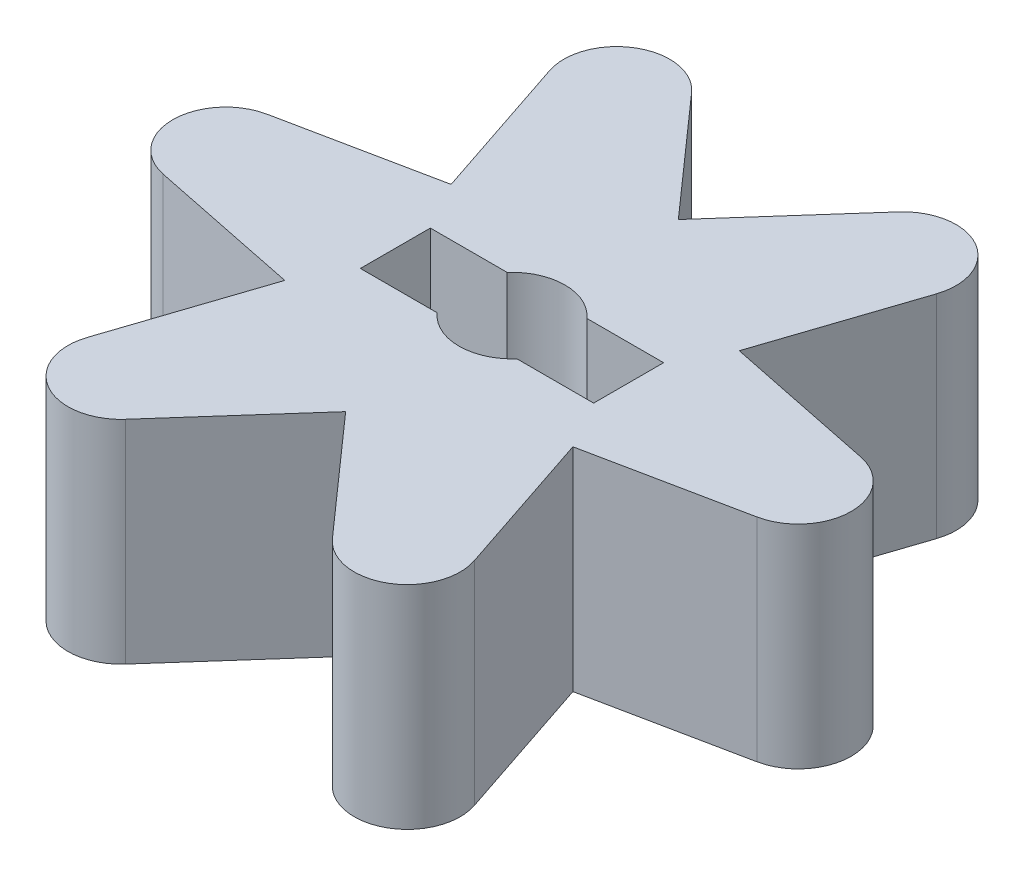
ISO-10303-21;
HEADER;
FILE_DESCRIPTION(('STEP AP214'),'2;1');
FILE_NAME('part.step','',(''),(''),'','','');
FILE_SCHEMA(('AUTOMOTIVE_DESIGN { 1 0 10303 214 1 1 1 1 }'));
ENDSEC;
DATA;
#1=APPLICATION_CONTEXT('core data for automotive mechanical design processes');
#2=APPLICATION_PROTOCOL_DEFINITION('international standard','automotive_design',2000,#1);
#3=PRODUCT_CONTEXT('',#1,'mechanical');
#4=PRODUCT('Part','Part','',(#3));
#5=PRODUCT_RELATED_PRODUCT_CATEGORY('part','',(#4));
#6=PRODUCT_DEFINITION_FORMATION('','',#4);
#7=PRODUCT_DEFINITION_CONTEXT('part definition',#1,'design');
#8=PRODUCT_DEFINITION('design','',#6,#7);
#9=PRODUCT_DEFINITION_SHAPE('','',#8);
#10=(LENGTH_UNIT() NAMED_UNIT(*) SI_UNIT(.MILLI.,.METRE.));
#11=(NAMED_UNIT(*) PLANE_ANGLE_UNIT() SI_UNIT($,.RADIAN.));
#12=(NAMED_UNIT(*) SI_UNIT($,.STERADIAN.) SOLID_ANGLE_UNIT());
#13=UNCERTAINTY_MEASURE_WITH_UNIT(LENGTH_MEASURE(1.E-05),#10,'distance_accuracy_value','');
#14=(GEOMETRIC_REPRESENTATION_CONTEXT(3) GLOBAL_UNCERTAINTY_ASSIGNED_CONTEXT((#13)) GLOBAL_UNIT_ASSIGNED_CONTEXT((#10,
#11,#12)) REPRESENTATION_CONTEXT('',''));
#15=CARTESIAN_POINT('',(0.,0.,0.));
#16=DIRECTION('',(0.,0.,1.));
#17=DIRECTION('',(1.,0.,0.));
#18=AXIS2_PLACEMENT_3D('',#15,#16,#17);
#19=CARTESIAN_POINT('',(0.,10.,0.));
#20=DIRECTION('',(0.,1.,0.));
#21=DIRECTION('',(0.,0.,1.));
#22=AXIS2_PLACEMENT_3D('',#19,#20,#21);
#23=PLANE('',#22);
#24=DIRECTION('',(0.979741032851596,0.,0.200268591014389));
#25=VECTOR('',#24,1.);
#26=CARTESIAN_POINT('',(1.04212284291897,10.,-5.0982058909393));
#27=LINE('',#26,#25);
#28=CARTESIAN_POINT('',(6.79393419734496,10.,-3.92247973769372));
#29=VERTEX_POINT('',#28);
#30=CARTESIAN_POINT('',(14.000671477536,10.,-2.44935258212899));
#31=VERTEX_POINT('',#30);
#32=EDGE_CURVE('E352',#29,#31,#27,.T.);
#33=ORIENTED_EDGE('',*,*,#32,.F.);
#34=DIRECTION('',(0.316432829027221,0.,-0.948614919086681));
#35=VECTOR('',#34,1.);
#36=CARTESIAN_POINT('',(4.93623723673639,10.,1.64659808963776));
#37=LINE('',#36,#35);
#38=CARTESIAN_POINT('',(9.12153729771669,10.,-10.9002608785219));
#39=VERTEX_POINT('',#38);
#40=EDGE_CURVE('E402',#29,#39,#37,.T.);
#41=ORIENTED_EDGE('',*,*,#40,.T.);
#42=CARTESIAN_POINT('',(6.75,10.,-11.6913429510899));
#43=DIRECTION('',(0.,1.,0.));
#44=DIRECTION('',(0.,0.,1.));
#45=AXIS2_PLACEMENT_3D('',#42,#43,#44);
#46=CIRCLE('',#45,2.5);
#47=CARTESIAN_POINT('',(4.87913417981926,10.,-13.3496134606509));
#48=VERTEX_POINT('',#47);
#49=EDGE_CURVE('E494',#48,#39,#46,.F.);
#50=ORIENTED_EDGE('',*,*,#49,.F.);
#51=DIRECTION('',(0.663308203824374,0.,-0.748346328072293));
#52=VECTOR('',#51,1.);
#53=CARTESIAN_POINT('',(-3.89411439381743,10.,-3.45160780130153));
#54=LINE('',#53,#52);
#55=CARTESIAN_POINT('',(0.,10.,-7.84495947538744));
#56=VERTEX_POINT('',#55);
#57=EDGE_CURVE('E491',#56,#48,#54,.T.);
#58=ORIENTED_EDGE('',*,*,#57,.F.);
#59=DIRECTION('',(-0.663308203824374,0.,-0.748346328072292));
#60=VECTOR('',#59,1.);
#61=CARTESIAN_POINT('',(3.89411439381742,10.,-3.45160780130153));
#62=LINE('',#61,#60);
#63=CARTESIAN_POINT('',(-4.87913417981927,10.,-13.3496134606509));
#64=VERTEX_POINT('',#63);
#65=EDGE_CURVE('E493',#56,#64,#62,.T.);
#66=ORIENTED_EDGE('',*,*,#65,.T.);
#67=CARTESIAN_POINT('',(-6.75000000000001,10.,-11.6913429510899));
#68=DIRECTION('',(0.,1.,0.));
#69=DIRECTION('',(0.,0.,1.));
#70=AXIS2_PLACEMENT_3D('',#67,#68,#69);
#71=CIRCLE('',#70,2.5);
#72=CARTESIAN_POINT('',(-9.12153729771671,10.,-10.9002608785219));
#73=VERTEX_POINT('',#72);
#74=EDGE_CURVE('E498',#73,#64,#71,.F.);
#75=ORIENTED_EDGE('',*,*,#74,.F.);
#76=DIRECTION('',(-0.316432829027222,0.,-0.94861491908668));
#77=VECTOR('',#76,1.);
#78=CARTESIAN_POINT('',(-4.93623723673639,10.,1.64659808963777));
#79=LINE('',#78,#77);
#80=CARTESIAN_POINT('',(-6.79393419734497,10.,-3.92247973769372));
#81=VERTEX_POINT('',#80);
#82=EDGE_CURVE('E506',#81,#73,#79,.T.);
#83=ORIENTED_EDGE('',*,*,#82,.F.);
#84=DIRECTION('',(-0.979741032851596,0.,0.200268591014388));
#85=VECTOR('',#84,1.);
#86=CARTESIAN_POINT('',(-1.04212284291896,10.,-5.09820589093929));
#87=LINE('',#86,#85);
#88=CARTESIAN_POINT('',(-14.000671477536,10.,-2.44935258212899));
#89=VERTEX_POINT('',#88);
#90=EDGE_CURVE('E510',#81,#89,#87,.T.);
#91=ORIENTED_EDGE('',*,*,#90,.T.);
#92=CARTESIAN_POINT('',(-13.5,10.,0.));
#93=DIRECTION('',(0.,1.,0.));
#94=DIRECTION('',(0.,0.,1.));
#95=AXIS2_PLACEMENT_3D('',#92,#93,#94);
#96=CIRCLE('',#95,2.5);
#97=CARTESIAN_POINT('',(-14.000671477536,10.,2.44935258212899));
#98=VERTEX_POINT('',#97);
#99=EDGE_CURVE('E513',#98,#89,#96,.F.);
#100=ORIENTED_EDGE('',*,*,#99,.F.);
#101=DIRECTION('',(-0.979741032851596,0.,-0.200268591014388));
#102=VECTOR('',#101,1.);
#103=CARTESIAN_POINT('',(-1.04212284291896,10.,5.0982058909393));
#104=LINE('',#103,#102);
#105=CARTESIAN_POINT('',(-6.79393419734496,10.,3.92247973769372));
#106=VERTEX_POINT('',#105);
#107=EDGE_CURVE('E517',#106,#98,#104,.T.);
#108=ORIENTED_EDGE('',*,*,#107,.F.);
#109=DIRECTION('',(-0.316432829027221,0.,0.948614919086681));
#110=VECTOR('',#109,1.);
#111=CARTESIAN_POINT('',(-4.93623723673639,10.,-1.64659808963776));
#112=LINE('',#111,#110);
#113=CARTESIAN_POINT('',(-9.1215372977167,10.,10.9002608785219));
#114=VERTEX_POINT('',#113);
#115=EDGE_CURVE('E521',#106,#114,#112,.T.);
#116=ORIENTED_EDGE('',*,*,#115,.T.);
#117=CARTESIAN_POINT('',(-6.75,10.,11.6913429510899));
#118=DIRECTION('',(0.,1.,0.));
#119=DIRECTION('',(0.,0.,1.));
#120=AXIS2_PLACEMENT_3D('',#117,#118,#119);
#121=CIRCLE('',#120,2.5);
#122=CARTESIAN_POINT('',(-4.87913417981927,10.,13.3496134606509));
#123=VERTEX_POINT('',#122);
#124=EDGE_CURVE('E524',#123,#114,#121,.F.);
#125=ORIENTED_EDGE('',*,*,#124,.F.);
#126=DIRECTION('',(-0.663308203824374,0.,0.748346328072292));
#127=VECTOR('',#126,1.);
#128=CARTESIAN_POINT('',(3.89411439381743,10.,3.45160780130153));
#129=LINE('',#128,#127);
#130=CARTESIAN_POINT('',(0.,10.,7.84495947538744));
#131=VERTEX_POINT('',#130);
#132=EDGE_CURVE('E528',#131,#123,#129,.T.);
#133=ORIENTED_EDGE('',*,*,#132,.F.);
#134=DIRECTION('',(0.663308203824374,0.,0.748346328072292));
#135=VECTOR('',#134,1.);
#136=CARTESIAN_POINT('',(-3.89411439381743,10.,3.45160780130153));
#137=LINE('',#136,#135);
#138=CARTESIAN_POINT('',(4.87913417981927,10.,13.3496134606509));
#139=VERTEX_POINT('',#138);
#140=EDGE_CURVE('E277',#131,#139,#137,.T.);
#141=ORIENTED_EDGE('',*,*,#140,.T.);
#142=CARTESIAN_POINT('',(6.75,10.,11.6913429510899));
#143=DIRECTION('',(0.,1.,0.));
#144=DIRECTION('',(0.,0.,1.));
#145=AXIS2_PLACEMENT_3D('',#142,#143,#144);
#146=CIRCLE('',#145,2.5);
#147=CARTESIAN_POINT('',(9.1215372977167,10.,10.9002608785219));
#148=VERTEX_POINT('',#147);
#149=EDGE_CURVE('E273',#148,#139,#146,.F.);
#150=ORIENTED_EDGE('',*,*,#149,.F.);
#151=DIRECTION('',(0.316432829027222,0.,0.94861491908668));
#152=VECTOR('',#151,1.);
#153=CARTESIAN_POINT('',(4.93623723673639,10.,-1.64659808963777));
#154=LINE('',#153,#152);
#155=CARTESIAN_POINT('',(6.79393419734496,10.,3.92247973769372));
#156=VERTEX_POINT('',#155);
#157=EDGE_CURVE('E251',#156,#148,#154,.T.);
#158=ORIENTED_EDGE('',*,*,#157,.F.);
#159=DIRECTION('',(0.979741032851596,0.,-0.200268591014389));
#160=VECTOR('',#159,1.);
#161=CARTESIAN_POINT('',(1.04212284291897,10.,5.0982058909393));
#162=LINE('',#161,#160);
#163=CARTESIAN_POINT('',(14.000671477536,10.,2.44935258212899));
#164=VERTEX_POINT('',#163);
#165=EDGE_CURVE('E262',#156,#164,#162,.T.);
#166=ORIENTED_EDGE('',*,*,#165,.T.);
#167=CARTESIAN_POINT('',(13.5,10.,0.));
#168=DIRECTION('',(0.,1.,0.));
#169=DIRECTION('',(0.,0.,1.));
#170=AXIS2_PLACEMENT_3D('',#167,#168,#169);
#171=CIRCLE('',#170,2.5);
#172=EDGE_CURVE('E267',#31,#164,#171,.F.);
#173=ORIENTED_EDGE('',*,*,#172,.F.);
#174=EDGE_LOOP('',(#33,#41,#50,#58,#66,#75,#83,#91,#100,#108,#116,#125,#133,#141,#150,#158,#166,#173));
#175=FACE_BOUND('',#174,.T.);
#176=CARTESIAN_POINT('',(0.,10.,0.));
#177=DIRECTION('',(0.,1.,0.));
#178=DIRECTION('',(0.,0.,1.));
#179=AXIS2_PLACEMENT_3D('',#176,#177,#178);
#180=CIRCLE('',#179,2.5);
#181=CARTESIAN_POINT('',(-1.87816399709929,10.,1.65));
#182=VERTEX_POINT('',#181);
#183=CARTESIAN_POINT('',(1.87816399709929,10.,1.65));
#184=VERTEX_POINT('',#183);
#185=EDGE_CURVE('E597',#182,#184,#180,.T.);
#186=ORIENTED_EDGE('',*,*,#185,.F.);
#187=DIRECTION('',(-1.,0.,0.));
#188=VECTOR('',#187,1.);
#189=CARTESIAN_POINT('',(0.,10.,1.65));
#190=LINE('',#189,#188);
#191=CARTESIAN_POINT('',(-5.5,10.,1.65));
#192=VERTEX_POINT('',#191);
#193=EDGE_CURVE('E123',#182,#192,#190,.T.);
#194=ORIENTED_EDGE('',*,*,#193,.T.);
#195=DIRECTION('',(0.,0.,-1.));
#196=VECTOR('',#195,1.);
#197=CARTESIAN_POINT('',(-5.5,10.,0.));
#198=LINE('',#197,#196);
#199=CARTESIAN_POINT('',(-5.5,10.,-1.65));
#200=VERTEX_POINT('',#199);
#201=EDGE_CURVE('E572',#192,#200,#198,.T.);
#202=ORIENTED_EDGE('',*,*,#201,.T.);
#203=DIRECTION('',(1.,0.,0.));
#204=VECTOR('',#203,1.);
#205=CARTESIAN_POINT('',(0.,10.,-1.65));
#206=LINE('',#205,#204);
#207=CARTESIAN_POINT('',(-1.87816399709929,10.,-1.65));
#208=VERTEX_POINT('',#207);
#209=EDGE_CURVE('E577',#200,#208,#206,.T.);
#210=ORIENTED_EDGE('',*,*,#209,.T.);
#211=CARTESIAN_POINT('',(0.,10.,0.));
#212=DIRECTION('',(0.,1.,0.));
#213=DIRECTION('',(0.,0.,1.));
#214=AXIS2_PLACEMENT_3D('',#211,#212,#213);
#215=CIRCLE('',#214,2.5);
#216=CARTESIAN_POINT('',(1.87816399709929,10.,-1.65));
#217=VERTEX_POINT('',#216);
#218=EDGE_CURVE('E581',#217,#208,#215,.T.);
#219=ORIENTED_EDGE('',*,*,#218,.F.);
#220=DIRECTION('',(-1.,0.,0.));
#221=VECTOR('',#220,1.);
#222=CARTESIAN_POINT('',(0.,10.,-1.65));
#223=LINE('',#222,#221);
#224=CARTESIAN_POINT('',(5.5,10.,-1.65));
#225=VERTEX_POINT('',#224);
#226=EDGE_CURVE('E585',#225,#217,#223,.T.);
#227=ORIENTED_EDGE('',*,*,#226,.F.);
#228=DIRECTION('',(0.,0.,-1.));
#229=VECTOR('',#228,1.);
#230=CARTESIAN_POINT('',(5.5,10.,0.));
#231=LINE('',#230,#229);
#232=CARTESIAN_POINT('',(5.5,10.,1.65));
#233=VERTEX_POINT('',#232);
#234=EDGE_CURVE('E589',#233,#225,#231,.T.);
#235=ORIENTED_EDGE('',*,*,#234,.F.);
#236=DIRECTION('',(1.,0.,0.));
#237=VECTOR('',#236,1.);
#238=CARTESIAN_POINT('',(0.,10.,1.65));
#239=LINE('',#238,#237);
#240=EDGE_CURVE('E593',#184,#233,#239,.T.);
#241=ORIENTED_EDGE('',*,*,#240,.F.);
#242=EDGE_LOOP('',(#186,#194,#202,#210,#219,#227,#235,#241));
#243=FACE_BOUND('',#242,.T.);
#244=ADVANCED_FACE('F106',(#175,#243),#23,.T.);
#245=CARTESIAN_POINT('',(4.93623723673639,10.,1.64659808963776));
#246=DIRECTION('',(-0.948614919086681,0.,-0.316432829027221));
#247=DIRECTION('',(-0.316432829027221,0.,0.948614919086681));
#248=AXIS2_PLACEMENT_3D('',#245,#246,#247);
#249=PLANE('',#248);
#250=DIRECTION('',(0.316432829027221,0.,-0.948614919086681));
#251=VECTOR('',#250,1.);
#252=CARTESIAN_POINT('',(4.93623723673639,0.,1.64659808963776));
#253=LINE('',#252,#251);
#254=CARTESIAN_POINT('',(6.79393419734496,0.,-3.92247973769372));
#255=VERTEX_POINT('',#254);
#256=CARTESIAN_POINT('',(9.12153729771669,0.,-10.9002608785219));
#257=VERTEX_POINT('',#256);
#258=EDGE_CURVE('E286',#255,#257,#253,.T.);
#259=ORIENTED_EDGE('',*,*,#258,.T.);
#260=DIRECTION('',(0.,-1.,0.));
#261=VECTOR('',#260,1.);
#262=CARTESIAN_POINT('',(9.12153729771669,10.,-10.9002608785219));
#263=LINE('',#262,#261);
#264=EDGE_CURVE('E395',#39,#257,#263,.T.);
#265=ORIENTED_EDGE('',*,*,#264,.F.);
#266=ORIENTED_EDGE('',*,*,#40,.F.);
#267=DIRECTION('',(0.,-1.,0.));
#268=VECTOR('',#267,1.);
#269=CARTESIAN_POINT('',(6.79393419734496,10.,-3.92247973769372));
#270=LINE('',#269,#268);
#271=EDGE_CURVE('E116',#29,#255,#270,.T.);
#272=ORIENTED_EDGE('',*,*,#271,.T.);
#273=EDGE_LOOP('',(#259,#265,#266,#272));
#274=FACE_BOUND('',#273,.T.);
#275=ADVANCED_FACE('F400',(#274),#249,.F.);
#276=CARTESIAN_POINT('',(6.75,10.,-11.6913429510899));
#277=DIRECTION('',(0.,-1.,0.));
#278=DIRECTION('',(0.,0.,-1.));
#279=AXIS2_PLACEMENT_3D('',#276,#277,#278);
#280=CYLINDRICAL_SURFACE('',#279,2.5);
#281=CARTESIAN_POINT('',(6.75,0.,-11.6913429510899));
#282=DIRECTION('',(0.,1.,0.));
#283=DIRECTION('',(0.,0.,1.));
#284=AXIS2_PLACEMENT_3D('',#281,#282,#283);
#285=CIRCLE('',#284,2.5);
#286=CARTESIAN_POINT('',(4.87913417981926,0.,-13.3496134606509));
#287=VERTEX_POINT('',#286);
#288=EDGE_CURVE('E291',#287,#257,#285,.F.);
#289=ORIENTED_EDGE('',*,*,#288,.F.);
#290=DIRECTION('',(0.,-1.,0.));
#291=VECTOR('',#290,1.);
#292=CARTESIAN_POINT('',(4.87913417981926,10.,-13.3496134606509));
#293=LINE('',#292,#291);
#294=EDGE_CURVE('E392',#48,#287,#293,.T.);
#295=ORIENTED_EDGE('',*,*,#294,.F.);
#296=ORIENTED_EDGE('',*,*,#49,.T.);
#297=ORIENTED_EDGE('',*,*,#264,.T.);
#298=EDGE_LOOP('',(#289,#295,#296,#297));
#299=FACE_BOUND('',#298,.T.);
#300=ADVANCED_FACE('F424',(#299),#280,.T.);
#301=CARTESIAN_POINT('',(-3.89411439381743,10.,-3.45160780130153));
#302=DIRECTION('',(-0.748346328072293,0.,-0.663308203824374));
#303=DIRECTION('',(-0.663308203824374,0.,0.748346328072293));
#304=AXIS2_PLACEMENT_3D('',#301,#302,#303);
#305=PLANE('',#304);
#306=DIRECTION('',(0.663308203824374,0.,-0.748346328072293));
#307=VECTOR('',#306,1.);
#308=CARTESIAN_POINT('',(-3.89411439381743,0.,-3.45160780130153));
#309=LINE('',#308,#307);
#310=CARTESIAN_POINT('',(0.,0.,-7.84495947538744));
#311=VERTEX_POINT('',#310);
#312=EDGE_CURVE('E295',#311,#287,#309,.T.);
#313=ORIENTED_EDGE('',*,*,#312,.F.);
#314=DIRECTION('',(0.,-1.,0.));
#315=VECTOR('',#314,1.);
#316=CARTESIAN_POINT('',(0.,10.,-7.84495947538744));
#317=LINE('',#316,#315);
#318=EDGE_CURVE('E389',#56,#311,#317,.T.);
#319=ORIENTED_EDGE('',*,*,#318,.F.);
#320=ORIENTED_EDGE('',*,*,#57,.T.);
#321=ORIENTED_EDGE('',*,*,#294,.T.);
#322=EDGE_LOOP('',(#313,#319,#320,#321));
#323=FACE_BOUND('',#322,.T.);
#324=ADVANCED_FACE('F475',(#323),#305,.T.);
#325=CARTESIAN_POINT('',(3.89411439381742,10.,-3.45160780130153));
#326=DIRECTION('',(-0.748346328072292,0.,0.663308203824374));
#327=DIRECTION('',(0.663308203824374,0.,0.748346328072292));
#328=AXIS2_PLACEMENT_3D('',#325,#326,#327);
#329=PLANE('',#328);
#330=DIRECTION('',(-0.663308203824374,0.,-0.748346328072292));
#331=VECTOR('',#330,1.);
#332=CARTESIAN_POINT('',(3.89411439381742,0.,-3.45160780130153));
#333=LINE('',#332,#331);
#334=CARTESIAN_POINT('',(-4.87913417981927,0.,-13.3496134606509));
#335=VERTEX_POINT('',#334);
#336=EDGE_CURVE('E299',#311,#335,#333,.T.);
#337=ORIENTED_EDGE('',*,*,#336,.T.);
#338=DIRECTION('',(0.,-1.,0.));
#339=VECTOR('',#338,1.);
#340=CARTESIAN_POINT('',(-4.87913417981927,10.,-13.3496134606509));
#341=LINE('',#340,#339);
#342=EDGE_CURVE('E386',#64,#335,#341,.T.);
#343=ORIENTED_EDGE('',*,*,#342,.F.);
#344=ORIENTED_EDGE('',*,*,#65,.F.);
#345=ORIENTED_EDGE('',*,*,#318,.T.);
#346=EDGE_LOOP('',(#337,#343,#344,#345));
#347=FACE_BOUND('',#346,.T.);
#348=ADVANCED_FACE('F471',(#347),#329,.F.);
#349=CARTESIAN_POINT('',(-6.75000000000001,10.,-11.6913429510899));
#350=DIRECTION('',(0.,-1.,0.));
#351=DIRECTION('',(0.,0.,-1.));
#352=AXIS2_PLACEMENT_3D('',#349,#350,#351);
#353=CYLINDRICAL_SURFACE('',#352,2.5);
#354=CARTESIAN_POINT('',(-6.75000000000001,0.,-11.6913429510899));
#355=DIRECTION('',(0.,1.,0.));
#356=DIRECTION('',(0.,0.,1.));
#357=AXIS2_PLACEMENT_3D('',#354,#355,#356);
#358=CIRCLE('',#357,2.5);
#359=CARTESIAN_POINT('',(-9.12153729771671,0.,-10.9002608785219));
#360=VERTEX_POINT('',#359);
#361=EDGE_CURVE('E303',#360,#335,#358,.F.);
#362=ORIENTED_EDGE('',*,*,#361,.F.);
#363=DIRECTION('',(0.,-1.,0.));
#364=VECTOR('',#363,1.);
#365=CARTESIAN_POINT('',(-9.12153729771671,10.,-10.9002608785219));
#366=LINE('',#365,#364);
#367=EDGE_CURVE('E383',#73,#360,#366,.T.);
#368=ORIENTED_EDGE('',*,*,#367,.F.);
#369=ORIENTED_EDGE('',*,*,#74,.T.);
#370=ORIENTED_EDGE('',*,*,#342,.T.);
#371=EDGE_LOOP('',(#362,#368,#369,#370));
#372=FACE_BOUND('',#371,.T.);
#373=ADVANCED_FACE('F467',(#372),#353,.T.);
#374=CARTESIAN_POINT('',(-4.93623723673639,10.,1.64659808963777));
#375=DIRECTION('',(-0.94861491908668,0.,0.316432829027222));
#376=DIRECTION('',(0.316432829027222,0.,0.94861491908668));
#377=AXIS2_PLACEMENT_3D('',#374,#375,#376);
#378=PLANE('',#377);
#379=DIRECTION('',(-0.316432829027222,0.,-0.94861491908668));
#380=VECTOR('',#379,1.);
#381=CARTESIAN_POINT('',(-4.93623723673639,0.,1.64659808963777));
#382=LINE('',#381,#380);
#383=CARTESIAN_POINT('',(-6.79393419734497,0.,-3.92247973769372));
#384=VERTEX_POINT('',#383);
#385=EDGE_CURVE('E307',#384,#360,#382,.T.);
#386=ORIENTED_EDGE('',*,*,#385,.F.);
#387=DIRECTION('',(0.,-1.,0.));
#388=VECTOR('',#387,1.);
#389=CARTESIAN_POINT('',(-6.79393419734497,10.,-3.92247973769372));
#390=LINE('',#389,#388);
#391=EDGE_CURVE('E380',#81,#384,#390,.T.);
#392=ORIENTED_EDGE('',*,*,#391,.F.);
#393=ORIENTED_EDGE('',*,*,#82,.T.);
#394=ORIENTED_EDGE('',*,*,#367,.T.);
#395=EDGE_LOOP('',(#386,#392,#393,#394));
#396=FACE_BOUND('',#395,.T.);
#397=ADVANCED_FACE('F463',(#396),#378,.T.);
#398=CARTESIAN_POINT('',(-1.04212284291896,10.,-5.09820589093929));
#399=DIRECTION('',(0.200268591014388,0.,0.979741032851596));
#400=DIRECTION('',(0.979741032851596,0.,-0.200268591014388));
#401=AXIS2_PLACEMENT_3D('',#398,#399,#400);
#402=PLANE('',#401);
#403=DIRECTION('',(-0.979741032851596,0.,0.200268591014388));
#404=VECTOR('',#403,1.);
#405=CARTESIAN_POINT('',(-1.04212284291896,0.,-5.09820589093929));
#406=LINE('',#405,#404);
#407=CARTESIAN_POINT('',(-14.000671477536,0.,-2.44935258212899));
#408=VERTEX_POINT('',#407);
#409=EDGE_CURVE('E311',#384,#408,#406,.T.);
#410=ORIENTED_EDGE('',*,*,#409,.T.);
#411=DIRECTION('',(0.,-1.,0.));
#412=VECTOR('',#411,1.);
#413=CARTESIAN_POINT('',(-14.000671477536,10.,-2.44935258212899));
#414=LINE('',#413,#412);
#415=EDGE_CURVE('E377',#89,#408,#414,.T.);
#416=ORIENTED_EDGE('',*,*,#415,.F.);
#417=ORIENTED_EDGE('',*,*,#90,.F.);
#418=ORIENTED_EDGE('',*,*,#391,.T.);
#419=EDGE_LOOP('',(#410,#416,#417,#418));
#420=FACE_BOUND('',#419,.T.);
#421=ADVANCED_FACE('F459',(#420),#402,.F.);
#422=CARTESIAN_POINT('',(-13.5,10.,0.));
#423=DIRECTION('',(0.,-1.,0.));
#424=DIRECTION('',(0.,0.,-1.));
#425=AXIS2_PLACEMENT_3D('',#422,#423,#424);
#426=CYLINDRICAL_SURFACE('',#425,2.5);
#427=CARTESIAN_POINT('',(-13.5,0.,0.));
#428=DIRECTION('',(0.,1.,0.));
#429=DIRECTION('',(0.,0.,1.));
#430=AXIS2_PLACEMENT_3D('',#427,#428,#429);
#431=CIRCLE('',#430,2.5);
#432=CARTESIAN_POINT('',(-14.000671477536,0.,2.44935258212899));
#433=VERTEX_POINT('',#432);
#434=EDGE_CURVE('E315',#433,#408,#431,.F.);
#435=ORIENTED_EDGE('',*,*,#434,.F.);
#436=DIRECTION('',(0.,-1.,0.));
#437=VECTOR('',#436,1.);
#438=CARTESIAN_POINT('',(-14.000671477536,10.,2.44935258212899));
#439=LINE('',#438,#437);
#440=EDGE_CURVE('E374',#98,#433,#439,.T.);
#441=ORIENTED_EDGE('',*,*,#440,.F.);
#442=ORIENTED_EDGE('',*,*,#99,.T.);
#443=ORIENTED_EDGE('',*,*,#415,.T.);
#444=EDGE_LOOP('',(#435,#441,#442,#443));
#445=FACE_BOUND('',#444,.T.);
#446=ADVANCED_FACE('F455',(#445),#426,.T.);
#447=CARTESIAN_POINT('',(-1.04212284291896,10.,5.0982058909393));
#448=DIRECTION('',(-0.200268591014388,0.,0.979741032851596));
#449=DIRECTION('',(0.979741032851596,0.,0.200268591014388));
#450=AXIS2_PLACEMENT_3D('',#447,#448,#449);
#451=PLANE('',#450);
#452=DIRECTION('',(-0.979741032851596,0.,-0.200268591014388));
#453=VECTOR('',#452,1.);
#454=CARTESIAN_POINT('',(-1.04212284291896,0.,5.0982058909393));
#455=LINE('',#454,#453);
#456=CARTESIAN_POINT('',(-6.79393419734496,0.,3.92247973769372));
#457=VERTEX_POINT('',#456);
#458=EDGE_CURVE('E319',#457,#433,#455,.T.);
#459=ORIENTED_EDGE('',*,*,#458,.F.);
#460=DIRECTION('',(0.,-1.,0.));
#461=VECTOR('',#460,1.);
#462=CARTESIAN_POINT('',(-6.79393419734496,10.,3.92247973769372));
#463=LINE('',#462,#461);
#464=EDGE_CURVE('E371',#106,#457,#463,.T.);
#465=ORIENTED_EDGE('',*,*,#464,.F.);
#466=ORIENTED_EDGE('',*,*,#107,.T.);
#467=ORIENTED_EDGE('',*,*,#440,.T.);
#468=EDGE_LOOP('',(#459,#465,#466,#467));
#469=FACE_BOUND('',#468,.T.);
#470=ADVANCED_FACE('F451',(#469),#451,.T.);
#471=CARTESIAN_POINT('',(-4.93623723673639,10.,-1.64659808963776));
#472=DIRECTION('',(0.94861491908668,0.,0.316432829027221));
#473=DIRECTION('',(0.316432829027221,0.,-0.94861491908668));
#474=AXIS2_PLACEMENT_3D('',#471,#472,#473);
#475=PLANE('',#474);
#476=DIRECTION('',(-0.316432829027221,0.,0.948614919086681));
#477=VECTOR('',#476,1.);
#478=CARTESIAN_POINT('',(-4.93623723673639,0.,-1.64659808963776));
#479=LINE('',#478,#477);
#480=CARTESIAN_POINT('',(-9.1215372977167,0.,10.9002608785219));
#481=VERTEX_POINT('',#480);
#482=EDGE_CURVE('E323',#457,#481,#479,.T.);
#483=ORIENTED_EDGE('',*,*,#482,.T.);
#484=DIRECTION('',(0.,-1.,0.));
#485=VECTOR('',#484,1.);
#486=CARTESIAN_POINT('',(-9.1215372977167,10.,10.9002608785219));
#487=LINE('',#486,#485);
#488=EDGE_CURVE('E368',#114,#481,#487,.T.);
#489=ORIENTED_EDGE('',*,*,#488,.F.);
#490=ORIENTED_EDGE('',*,*,#115,.F.);
#491=ORIENTED_EDGE('',*,*,#464,.T.);
#492=EDGE_LOOP('',(#483,#489,#490,#491));
#493=FACE_BOUND('',#492,.T.);
#494=ADVANCED_FACE('F447',(#493),#475,.F.);
#495=CARTESIAN_POINT('',(-6.75,10.,11.6913429510899));
#496=DIRECTION('',(0.,-1.,0.));
#497=DIRECTION('',(0.,0.,-1.));
#498=AXIS2_PLACEMENT_3D('',#495,#496,#497);
#499=CYLINDRICAL_SURFACE('',#498,2.5);
#500=CARTESIAN_POINT('',(-6.75,0.,11.6913429510899));
#501=DIRECTION('',(0.,1.,0.));
#502=DIRECTION('',(0.,0.,1.));
#503=AXIS2_PLACEMENT_3D('',#500,#501,#502);
#504=CIRCLE('',#503,2.5);
#505=CARTESIAN_POINT('',(-4.87913417981927,0.,13.3496134606509));
#506=VERTEX_POINT('',#505);
#507=EDGE_CURVE('E327',#506,#481,#504,.F.);
#508=ORIENTED_EDGE('',*,*,#507,.F.);
#509=DIRECTION('',(0.,-1.,0.));
#510=VECTOR('',#509,1.);
#511=CARTESIAN_POINT('',(-4.87913417981927,10.,13.3496134606509));
#512=LINE('',#511,#510);
#513=EDGE_CURVE('E365',#123,#506,#512,.T.);
#514=ORIENTED_EDGE('',*,*,#513,.F.);
#515=ORIENTED_EDGE('',*,*,#124,.T.);
#516=ORIENTED_EDGE('',*,*,#488,.T.);
#517=EDGE_LOOP('',(#508,#514,#515,#516));
#518=FACE_BOUND('',#517,.T.);
#519=ADVANCED_FACE('F443',(#518),#499,.T.);
#520=CARTESIAN_POINT('',(3.89411439381743,10.,3.45160780130153));
#521=DIRECTION('',(0.748346328072292,0.,0.663308203824374));
#522=DIRECTION('',(0.663308203824374,0.,-0.748346328072292));
#523=AXIS2_PLACEMENT_3D('',#520,#521,#522);
#524=PLANE('',#523);
#525=DIRECTION('',(-0.663308203824374,0.,0.748346328072292));
#526=VECTOR('',#525,1.);
#527=CARTESIAN_POINT('',(3.89411439381743,0.,3.45160780130153));
#528=LINE('',#527,#526);
#529=CARTESIAN_POINT('',(0.,0.,7.84495947538744));
#530=VERTEX_POINT('',#529);
#531=EDGE_CURVE('E331',#530,#506,#528,.T.);
#532=ORIENTED_EDGE('',*,*,#531,.F.);
#533=DIRECTION('',(0.,-1.,0.));
#534=VECTOR('',#533,1.);
#535=CARTESIAN_POINT('',(0.,10.,7.84495947538744));
#536=LINE('',#535,#534);
#537=EDGE_CURVE('E362',#131,#530,#536,.T.);
#538=ORIENTED_EDGE('',*,*,#537,.F.);
#539=ORIENTED_EDGE('',*,*,#132,.T.);
#540=ORIENTED_EDGE('',*,*,#513,.T.);
#541=EDGE_LOOP('',(#532,#538,#539,#540));
#542=FACE_BOUND('',#541,.T.);
#543=ADVANCED_FACE('F439',(#542),#524,.T.);
#544=CARTESIAN_POINT('',(-3.89411439381743,10.,3.45160780130153));
#545=DIRECTION('',(0.748346328072292,0.,-0.663308203824374));
#546=DIRECTION('',(-0.663308203824374,0.,-0.748346328072292));
#547=AXIS2_PLACEMENT_3D('',#544,#545,#546);
#548=PLANE('',#547);
#549=DIRECTION('',(0.663308203824374,0.,0.748346328072292));
#550=VECTOR('',#549,1.);
#551=CARTESIAN_POINT('',(-3.89411439381743,0.,3.45160780130153));
#552=LINE('',#551,#550);
#553=CARTESIAN_POINT('',(4.87913417981927,0.,13.3496134606509));
#554=VERTEX_POINT('',#553);
#555=EDGE_CURVE('E335',#530,#554,#552,.T.);
#556=ORIENTED_EDGE('',*,*,#555,.T.);
#557=DIRECTION('',(0.,-1.,0.));
#558=VECTOR('',#557,1.);
#559=CARTESIAN_POINT('',(4.87913417981927,10.,13.3496134606509));
#560=LINE('',#559,#558);
#561=EDGE_CURVE('E359',#139,#554,#560,.T.);
#562=ORIENTED_EDGE('',*,*,#561,.F.);
#563=ORIENTED_EDGE('',*,*,#140,.F.);
#564=ORIENTED_EDGE('',*,*,#537,.T.);
#565=EDGE_LOOP('',(#556,#562,#563,#564));
#566=FACE_BOUND('',#565,.T.);
#567=ADVANCED_FACE('F435',(#566),#548,.F.);
#568=CARTESIAN_POINT('',(6.75,10.,11.6913429510899));
#569=DIRECTION('',(0.,-1.,0.));
#570=DIRECTION('',(0.,0.,-1.));
#571=AXIS2_PLACEMENT_3D('',#568,#569,#570);
#572=CYLINDRICAL_SURFACE('',#571,2.5);
#573=CARTESIAN_POINT('',(6.75,0.,11.6913429510899));
#574=DIRECTION('',(0.,1.,0.));
#575=DIRECTION('',(0.,0.,1.));
#576=AXIS2_PLACEMENT_3D('',#573,#574,#575);
#577=CIRCLE('',#576,2.5);
#578=CARTESIAN_POINT('',(9.1215372977167,0.,10.9002608785219));
#579=VERTEX_POINT('',#578);
#580=EDGE_CURVE('E339',#579,#554,#577,.F.);
#581=ORIENTED_EDGE('',*,*,#580,.F.);
#582=DIRECTION('',(0.,-1.,0.));
#583=VECTOR('',#582,1.);
#584=CARTESIAN_POINT('',(9.1215372977167,10.,10.9002608785219));
#585=LINE('',#584,#583);
#586=EDGE_CURVE('E258',#148,#579,#585,.T.);
#587=ORIENTED_EDGE('',*,*,#586,.F.);
#588=ORIENTED_EDGE('',*,*,#149,.T.);
#589=ORIENTED_EDGE('',*,*,#561,.T.);
#590=EDGE_LOOP('',(#581,#587,#588,#589));
#591=FACE_BOUND('',#590,.T.);
#592=ADVANCED_FACE('F432',(#591),#572,.T.);
#593=CARTESIAN_POINT('',(4.93623723673639,10.,-1.64659808963777));
#594=DIRECTION('',(0.94861491908668,0.,-0.316432829027222));
#595=DIRECTION('',(-0.316432829027222,0.,-0.94861491908668));
#596=AXIS2_PLACEMENT_3D('',#593,#594,#595);
#597=PLANE('',#596);
#598=DIRECTION('',(0.316432829027222,0.,0.94861491908668));
#599=VECTOR('',#598,1.);
#600=CARTESIAN_POINT('',(4.93623723673639,0.,-1.64659808963777));
#601=LINE('',#600,#599);
#602=CARTESIAN_POINT('',(6.79393419734496,0.,3.92247973769372));
#603=VERTEX_POINT('',#602);
#604=EDGE_CURVE('E253',#603,#579,#601,.T.);
#605=ORIENTED_EDGE('',*,*,#604,.F.);
#606=DIRECTION('',(0.,-1.,0.));
#607=VECTOR('',#606,1.);
#608=CARTESIAN_POINT('',(6.79393419734496,10.,3.92247973769372));
#609=LINE('',#608,#607);
#610=EDGE_CURVE('E247',#156,#603,#609,.T.);
#611=ORIENTED_EDGE('',*,*,#610,.F.);
#612=ORIENTED_EDGE('',*,*,#157,.T.);
#613=ORIENTED_EDGE('',*,*,#586,.T.);
#614=EDGE_LOOP('',(#605,#611,#612,#613));
#615=FACE_BOUND('',#614,.T.);
#616=ADVANCED_FACE('F249',(#615),#597,.T.);
#617=CARTESIAN_POINT('',(1.04212284291897,10.,5.0982058909393));
#618=DIRECTION('',(-0.200268591014389,0.,-0.979741032851596));
#619=DIRECTION('',(-0.979741032851596,0.,0.200268591014389));
#620=AXIS2_PLACEMENT_3D('',#617,#618,#619);
#621=PLANE('',#620);
#622=DIRECTION('',(0.979741032851596,0.,-0.200268591014389));
#623=VECTOR('',#622,1.);
#624=CARTESIAN_POINT('',(1.04212284291897,0.,5.0982058909393));
#625=LINE('',#624,#623);
#626=CARTESIAN_POINT('',(14.000671477536,0.,2.44935258212899));
#627=VERTEX_POINT('',#626);
#628=EDGE_CURVE('E345',#603,#627,#625,.T.);
#629=ORIENTED_EDGE('',*,*,#628,.T.);
#630=DIRECTION('',(0.,-1.,0.));
#631=VECTOR('',#630,1.);
#632=CARTESIAN_POINT('',(14.000671477536,10.,2.44935258212899));
#633=LINE('',#632,#631);
#634=EDGE_CURVE('E259',#164,#627,#633,.T.);
#635=ORIENTED_EDGE('',*,*,#634,.F.);
#636=ORIENTED_EDGE('',*,*,#165,.F.);
#637=ORIENTED_EDGE('',*,*,#610,.T.);
#638=EDGE_LOOP('',(#629,#635,#636,#637));
#639=FACE_BOUND('',#638,.T.);
#640=ADVANCED_FACE('F263',(#639),#621,.F.);
#641=CARTESIAN_POINT('',(13.5,10.,0.));
#642=DIRECTION('',(0.,-1.,0.));
#643=DIRECTION('',(0.,0.,-1.));
#644=AXIS2_PLACEMENT_3D('',#641,#642,#643);
#645=CYLINDRICAL_SURFACE('',#644,2.5);
#646=CARTESIAN_POINT('',(13.5,0.,0.));
#647=DIRECTION('',(0.,1.,0.));
#648=DIRECTION('',(0.,0.,1.));
#649=AXIS2_PLACEMENT_3D('',#646,#647,#648);
#650=CIRCLE('',#649,2.5);
#651=CARTESIAN_POINT('',(14.000671477536,0.,-2.44935258212899));
#652=VERTEX_POINT('',#651);
#653=EDGE_CURVE('E348',#652,#627,#650,.F.);
#654=ORIENTED_EDGE('',*,*,#653,.F.);
#655=DIRECTION('',(0.,-1.,0.));
#656=VECTOR('',#655,1.);
#657=CARTESIAN_POINT('',(14.000671477536,10.,-2.44935258212899));
#658=LINE('',#657,#656);
#659=EDGE_CURVE('E132',#31,#652,#658,.T.);
#660=ORIENTED_EDGE('',*,*,#659,.F.);
#661=ORIENTED_EDGE('',*,*,#172,.T.);
#662=ORIENTED_EDGE('',*,*,#634,.T.);
#663=EDGE_LOOP('',(#654,#660,#661,#662));
#664=FACE_BOUND('',#663,.T.);
#665=ADVANCED_FACE('F408',(#664),#645,.T.);
#666=CARTESIAN_POINT('',(1.04212284291897,10.,-5.0982058909393));
#667=DIRECTION('',(0.200268591014389,0.,-0.979741032851596));
#668=DIRECTION('',(-0.979741032851596,0.,-0.200268591014389));
#669=AXIS2_PLACEMENT_3D('',#666,#667,#668);
#670=PLANE('',#669);
#671=DIRECTION('',(0.979741032851596,0.,0.200268591014389));
#672=VECTOR('',#671,1.);
#673=CARTESIAN_POINT('',(1.04212284291897,0.,-5.0982058909393));
#674=LINE('',#673,#672);
#675=EDGE_CURVE('E283',#255,#652,#674,.T.);
#676=ORIENTED_EDGE('',*,*,#675,.F.);
#677=ORIENTED_EDGE('',*,*,#271,.F.);
#678=ORIENTED_EDGE('',*,*,#32,.T.);
#679=ORIENTED_EDGE('',*,*,#659,.T.);
#680=EDGE_LOOP('',(#676,#677,#678,#679));
#681=FACE_BOUND('',#680,.T.);
#682=ADVANCED_FACE('F406',(#681),#670,.T.);
#683=CARTESIAN_POINT('',(0.,0.,0.));
#684=DIRECTION('',(0.,1.,0.));
#685=DIRECTION('',(0.,0.,1.));
#686=AXIS2_PLACEMENT_3D('',#683,#684,#685);
#687=PLANE('',#686);
#688=CARTESIAN_POINT('',(0.,0.,0.));
#689=DIRECTION('',(0.,-1.,0.));
#690=DIRECTION('',(0.,0.,-1.));
#691=AXIS2_PLACEMENT_3D('',#688,#689,#690);
#692=CIRCLE('',#691,6.);
#693=CARTESIAN_POINT('',(0.,0.,-6.));
#694=VERTEX_POINT('',#693);
#695=EDGE_CURVE('E603',#694,#694,#692,.T.);
#696=ORIENTED_EDGE('',*,*,#695,.F.);
#697=EDGE_LOOP('',(#696));
#698=FACE_BOUND('',#697,.T.);
#699=ORIENTED_EDGE('',*,*,#675,.T.);
#700=ORIENTED_EDGE('',*,*,#653,.T.);
#701=ORIENTED_EDGE('',*,*,#628,.F.);
#702=ORIENTED_EDGE('',*,*,#604,.T.);
#703=ORIENTED_EDGE('',*,*,#580,.T.);
#704=ORIENTED_EDGE('',*,*,#555,.F.);
#705=ORIENTED_EDGE('',*,*,#531,.T.);
#706=ORIENTED_EDGE('',*,*,#507,.T.);
#707=ORIENTED_EDGE('',*,*,#482,.F.);
#708=ORIENTED_EDGE('',*,*,#458,.T.);
#709=ORIENTED_EDGE('',*,*,#434,.T.);
#710=ORIENTED_EDGE('',*,*,#409,.F.);
#711=ORIENTED_EDGE('',*,*,#385,.T.);
#712=ORIENTED_EDGE('',*,*,#361,.T.);
#713=ORIENTED_EDGE('',*,*,#336,.F.);
#714=ORIENTED_EDGE('',*,*,#312,.T.);
#715=ORIENTED_EDGE('',*,*,#288,.T.);
#716=ORIENTED_EDGE('',*,*,#258,.F.);
#717=EDGE_LOOP('',(#699,#700,#701,#702,#703,#704,#705,#706,#707,#708,#709,#710,#711,#712,#713,
#714,#715,#716));
#718=FACE_BOUND('',#717,.T.);
#719=ADVANCED_FACE('F404',(#698,#718),#687,.F.);
#720=CARTESIAN_POINT('',(0.,4.,1.65));
#721=DIRECTION('',(0.,0.,-1.));
#722=DIRECTION('',(-1.,0.,0.));
#723=AXIS2_PLACEMENT_3D('',#720,#721,#722);
#724=PLANE('',#723);
#725=ORIENTED_EDGE('',*,*,#193,.F.);
#726=DIRECTION('',(0.,1.,0.));
#727=VECTOR('',#726,1.);
#728=CARTESIAN_POINT('',(-1.87816399709929,4.,1.65));
#729=LINE('',#728,#727);
#730=CARTESIAN_POINT('',(-1.87816399709929,4.,1.65));
#731=VERTEX_POINT('',#730);
#732=EDGE_CURVE('E542',#731,#182,#729,.T.);
#733=ORIENTED_EDGE('',*,*,#732,.F.);
#734=DIRECTION('',(-1.,0.,0.));
#735=VECTOR('',#734,1.);
#736=CARTESIAN_POINT('',(0.,4.,1.65));
#737=LINE('',#736,#735);
#738=CARTESIAN_POINT('',(-5.5,4.,1.65));
#739=VERTEX_POINT('',#738);
#740=EDGE_CURVE('E576',#731,#739,#737,.T.);
#741=ORIENTED_EDGE('',*,*,#740,.T.);
#742=DIRECTION('',(0.,1.,0.));
#743=VECTOR('',#742,1.);
#744=CARTESIAN_POINT('',(-5.5,4.,1.65));
#745=LINE('',#744,#743);
#746=EDGE_CURVE('E287',#739,#192,#745,.T.);
#747=ORIENTED_EDGE('',*,*,#746,.T.);
#748=EDGE_LOOP('',(#725,#733,#741,#747));
#749=FACE_BOUND('',#748,.T.);
#750=ADVANCED_FACE('F414',(#749),#724,.T.);
#751=CARTESIAN_POINT('',(-5.5,4.,0.));
#752=DIRECTION('',(1.,0.,0.));
#753=DIRECTION('',(0.,0.,-1.));
#754=AXIS2_PLACEMENT_3D('',#751,#752,#753);
#755=PLANE('',#754);
#756=ORIENTED_EDGE('',*,*,#201,.F.);
#757=ORIENTED_EDGE('',*,*,#746,.F.);
#758=DIRECTION('',(0.,0.,-1.));
#759=VECTOR('',#758,1.);
#760=CARTESIAN_POINT('',(-5.5,4.,0.));
#761=LINE('',#760,#759);
#762=CARTESIAN_POINT('',(-5.5,4.,-1.65));
#763=VERTEX_POINT('',#762);
#764=EDGE_CURVE('E546',#739,#763,#761,.T.);
#765=ORIENTED_EDGE('',*,*,#764,.T.);
#766=DIRECTION('',(0.,1.,0.));
#767=VECTOR('',#766,1.);
#768=CARTESIAN_POINT('',(-5.5,4.,-1.65));
#769=LINE('',#768,#767);
#770=EDGE_CURVE('E566',#763,#200,#769,.T.);
#771=ORIENTED_EDGE('',*,*,#770,.T.);
#772=EDGE_LOOP('',(#756,#757,#765,#771));
#773=FACE_BOUND('',#772,.T.);
#774=ADVANCED_FACE('F653',(#773),#755,.T.);
#775=CARTESIAN_POINT('',(0.,4.,-1.65));
#776=DIRECTION('',(0.,0.,1.));
#777=DIRECTION('',(1.,0.,0.));
#778=AXIS2_PLACEMENT_3D('',#775,#776,#777);
#779=PLANE('',#778);
#780=ORIENTED_EDGE('',*,*,#209,.F.);
#781=ORIENTED_EDGE('',*,*,#770,.F.);
#782=DIRECTION('',(1.,0.,0.));
#783=VECTOR('',#782,1.);
#784=CARTESIAN_POINT('',(0.,4.,-1.65));
#785=LINE('',#784,#783);
#786=CARTESIAN_POINT('',(-1.87816399709929,4.,-1.65));
#787=VERTEX_POINT('',#786);
#788=EDGE_CURVE('E607',#763,#787,#785,.T.);
#789=ORIENTED_EDGE('',*,*,#788,.T.);
#790=DIRECTION('',(0.,1.,0.));
#791=VECTOR('',#790,1.);
#792=CARTESIAN_POINT('',(-1.87816399709929,4.,-1.65));
#793=LINE('',#792,#791);
#794=EDGE_CURVE('E562',#787,#208,#793,.T.);
#795=ORIENTED_EDGE('',*,*,#794,.T.);
#796=EDGE_LOOP('',(#780,#781,#789,#795));
#797=FACE_BOUND('',#796,.T.);
#798=ADVANCED_FACE('F656',(#797),#779,.T.);
#799=CARTESIAN_POINT('',(0.,4.,0.));
#800=DIRECTION('',(0.,1.,0.));
#801=DIRECTION('',(0.,0.,1.));
#802=AXIS2_PLACEMENT_3D('',#799,#800,#801);
#803=CYLINDRICAL_SURFACE('',#802,2.5);
#804=ORIENTED_EDGE('',*,*,#218,.T.);
#805=ORIENTED_EDGE('',*,*,#794,.F.);
#806=CARTESIAN_POINT('',(0.,4.,0.));
#807=DIRECTION('',(0.,1.,0.));
#808=DIRECTION('',(0.,0.,1.));
#809=AXIS2_PLACEMENT_3D('',#806,#807,#808);
#810=CIRCLE('',#809,2.5);
#811=CARTESIAN_POINT('',(1.87816399709929,4.,-1.65));
#812=VERTEX_POINT('',#811);
#813=EDGE_CURVE('E611',#812,#787,#810,.T.);
#814=ORIENTED_EDGE('',*,*,#813,.F.);
#815=DIRECTION('',(0.,1.,0.));
#816=VECTOR('',#815,1.);
#817=CARTESIAN_POINT('',(1.87816399709929,4.,-1.65));
#818=LINE('',#817,#816);
#819=EDGE_CURVE('E558',#812,#217,#818,.T.);
#820=ORIENTED_EDGE('',*,*,#819,.T.);
#821=EDGE_LOOP('',(#804,#805,#814,#820));
#822=FACE_BOUND('',#821,.T.);
#823=ADVANCED_FACE('F660',(#822),#803,.F.);
#824=CARTESIAN_POINT('',(0.,4.,-1.65));
#825=DIRECTION('',(0.,0.,-1.));
#826=DIRECTION('',(-1.,0.,0.));
#827=AXIS2_PLACEMENT_3D('',#824,#825,#826);
#828=PLANE('',#827);
#829=ORIENTED_EDGE('',*,*,#226,.T.);
#830=ORIENTED_EDGE('',*,*,#819,.F.);
#831=DIRECTION('',(-1.,0.,0.));
#832=VECTOR('',#831,1.);
#833=CARTESIAN_POINT('',(0.,4.,-1.65));
#834=LINE('',#833,#832);
#835=CARTESIAN_POINT('',(5.5,4.,-1.65));
#836=VERTEX_POINT('',#835);
#837=EDGE_CURVE('E615',#836,#812,#834,.T.);
#838=ORIENTED_EDGE('',*,*,#837,.F.);
#839=DIRECTION('',(0.,1.,0.));
#840=VECTOR('',#839,1.);
#841=CARTESIAN_POINT('',(5.5,4.,-1.65));
#842=LINE('',#841,#840);
#843=EDGE_CURVE('E554',#836,#225,#842,.T.);
#844=ORIENTED_EDGE('',*,*,#843,.T.);
#845=EDGE_LOOP('',(#829,#830,#838,#844));
#846=FACE_BOUND('',#845,.T.);
#847=ADVANCED_FACE('F664',(#846),#828,.F.);
#848=CARTESIAN_POINT('',(5.5,4.,0.));
#849=DIRECTION('',(1.,0.,0.));
#850=DIRECTION('',(0.,0.,-1.));
#851=AXIS2_PLACEMENT_3D('',#848,#849,#850);
#852=PLANE('',#851);
#853=ORIENTED_EDGE('',*,*,#234,.T.);
#854=ORIENTED_EDGE('',*,*,#843,.F.);
#855=DIRECTION('',(0.,0.,-1.));
#856=VECTOR('',#855,1.);
#857=CARTESIAN_POINT('',(5.5,4.,0.));
#858=LINE('',#857,#856);
#859=CARTESIAN_POINT('',(5.5,4.,1.65));
#860=VERTEX_POINT('',#859);
#861=EDGE_CURVE('E619',#860,#836,#858,.T.);
#862=ORIENTED_EDGE('',*,*,#861,.F.);
#863=DIRECTION('',(0.,1.,0.));
#864=VECTOR('',#863,1.);
#865=CARTESIAN_POINT('',(5.5,4.,1.65));
#866=LINE('',#865,#864);
#867=EDGE_CURVE('E550',#860,#233,#866,.T.);
#868=ORIENTED_EDGE('',*,*,#867,.T.);
#869=EDGE_LOOP('',(#853,#854,#862,#868));
#870=FACE_BOUND('',#869,.T.);
#871=ADVANCED_FACE('F668',(#870),#852,.F.);
#872=CARTESIAN_POINT('',(0.,4.,1.65));
#873=DIRECTION('',(0.,0.,1.));
#874=DIRECTION('',(1.,0.,0.));
#875=AXIS2_PLACEMENT_3D('',#872,#873,#874);
#876=PLANE('',#875);
#877=ORIENTED_EDGE('',*,*,#240,.T.);
#878=ORIENTED_EDGE('',*,*,#867,.F.);
#879=DIRECTION('',(1.,0.,0.));
#880=VECTOR('',#879,1.);
#881=CARTESIAN_POINT('',(0.,4.,1.65));
#882=LINE('',#881,#880);
#883=CARTESIAN_POINT('',(1.87816399709929,4.,1.65));
#884=VERTEX_POINT('',#883);
#885=EDGE_CURVE('E623',#884,#860,#882,.T.);
#886=ORIENTED_EDGE('',*,*,#885,.F.);
#887=DIRECTION('',(0.,1.,0.));
#888=VECTOR('',#887,1.);
#889=CARTESIAN_POINT('',(1.87816399709929,4.,1.65));
#890=LINE('',#889,#888);
#891=EDGE_CURVE('E545',#884,#184,#890,.T.);
#892=ORIENTED_EDGE('',*,*,#891,.T.);
#893=EDGE_LOOP('',(#877,#878,#886,#892));
#894=FACE_BOUND('',#893,.T.);
#895=ADVANCED_FACE('F672',(#894),#876,.F.);
#896=CARTESIAN_POINT('',(0.,4.,0.));
#897=DIRECTION('',(0.,1.,0.));
#898=DIRECTION('',(0.,0.,1.));
#899=AXIS2_PLACEMENT_3D('',#896,#897,#898);
#900=CYLINDRICAL_SURFACE('',#899,2.5);
#901=ORIENTED_EDGE('',*,*,#185,.T.);
#902=ORIENTED_EDGE('',*,*,#891,.F.);
#903=CARTESIAN_POINT('',(0.,4.,0.));
#904=DIRECTION('',(0.,1.,0.));
#905=DIRECTION('',(0.,0.,1.));
#906=AXIS2_PLACEMENT_3D('',#903,#904,#905);
#907=CIRCLE('',#906,2.5);
#908=EDGE_CURVE('E627',#731,#884,#907,.T.);
#909=ORIENTED_EDGE('',*,*,#908,.F.);
#910=ORIENTED_EDGE('',*,*,#732,.T.);
#911=EDGE_LOOP('',(#901,#902,#909,#910));
#912=FACE_BOUND('',#911,.T.);
#913=ADVANCED_FACE('F649',(#912),#900,.F.);
#914=CARTESIAN_POINT('',(0.,4.,0.));
#915=DIRECTION('',(0.,1.,0.));
#916=DIRECTION('',(0.,0.,1.));
#917=AXIS2_PLACEMENT_3D('',#914,#915,#916);
#918=PLANE('',#917);
#919=ORIENTED_EDGE('',*,*,#740,.F.);
#920=ORIENTED_EDGE('',*,*,#908,.T.);
#921=ORIENTED_EDGE('',*,*,#885,.T.);
#922=ORIENTED_EDGE('',*,*,#861,.T.);
#923=ORIENTED_EDGE('',*,*,#837,.T.);
#924=ORIENTED_EDGE('',*,*,#813,.T.);
#925=ORIENTED_EDGE('',*,*,#788,.F.);
#926=ORIENTED_EDGE('',*,*,#764,.F.);
#927=EDGE_LOOP('',(#919,#920,#921,#922,#923,#924,#925,#926));
#928=FACE_BOUND('',#927,.T.);
#929=ADVANCED_FACE('F644',(#928),#918,.T.);
#930=CARTESIAN_POINT('',(0.,2.,0.));
#931=DIRECTION('',(0.,-1.,0.));
#932=DIRECTION('',(0.,0.,-1.));
#933=AXIS2_PLACEMENT_3D('',#930,#931,#932);
#934=PLANE('',#933);
#935=CARTESIAN_POINT('',(0.,2.,0.));
#936=DIRECTION('',(0.,-1.,0.));
#937=DIRECTION('',(0.,0.,-1.));
#938=AXIS2_PLACEMENT_3D('',#935,#936,#937);
#939=CIRCLE('',#938,3.99999999999998);
#940=CARTESIAN_POINT('',(0.,2.,-3.99999999999998));
#941=VERTEX_POINT('',#940);
#942=EDGE_CURVE('E12',#941,#941,#939,.T.);
#943=ORIENTED_EDGE('',*,*,#942,.T.);
#944=EDGE_LOOP('',(#943));
#945=FACE_BOUND('',#944,.T.);
#946=ADVANCED_FACE('F640',(#945),#934,.T.);
#947=CARTESIAN_POINT('',(0.,2.,0.));
#948=DIRECTION('',(0.,-1.,0.));
#949=DIRECTION('',(0.,0.,-1.));
#950=AXIS2_PLACEMENT_3D('',#947,#948,#949);
#951=CONICAL_SURFACE('',#950,3.99999999999998,0.785398163397453);
#952=ORIENTED_EDGE('',*,*,#695,.T.);
#953=EDGE_LOOP('',(#952));
#954=FACE_BOUND('',#953,.T.);
#955=ORIENTED_EDGE('',*,*,#942,.F.);
#956=EDGE_LOOP('',(#955));
#957=FACE_BOUND('',#956,.T.);
#958=ADVANCED_FACE('F109',(#954,#957),#951,.F.);
#959=CLOSED_SHELL('',(#244,#275,#300,#324,#348,#373,#397,#421,#446,#470,#494,#519,#543,#567,
#592,#616,#640,#665,#682,#719,#750,#774,#798,#823,#847,#871,#895,#913,#929,#946,#958));
#960=MANIFOLD_SOLID_BREP('B2',#959);
#961=ADVANCED_BREP_SHAPE_REPRESENTATION('',(#18,#960),#14);
#962=SHAPE_DEFINITION_REPRESENTATION(#9,#961);
ENDSEC;
END-ISO-10303-21;
